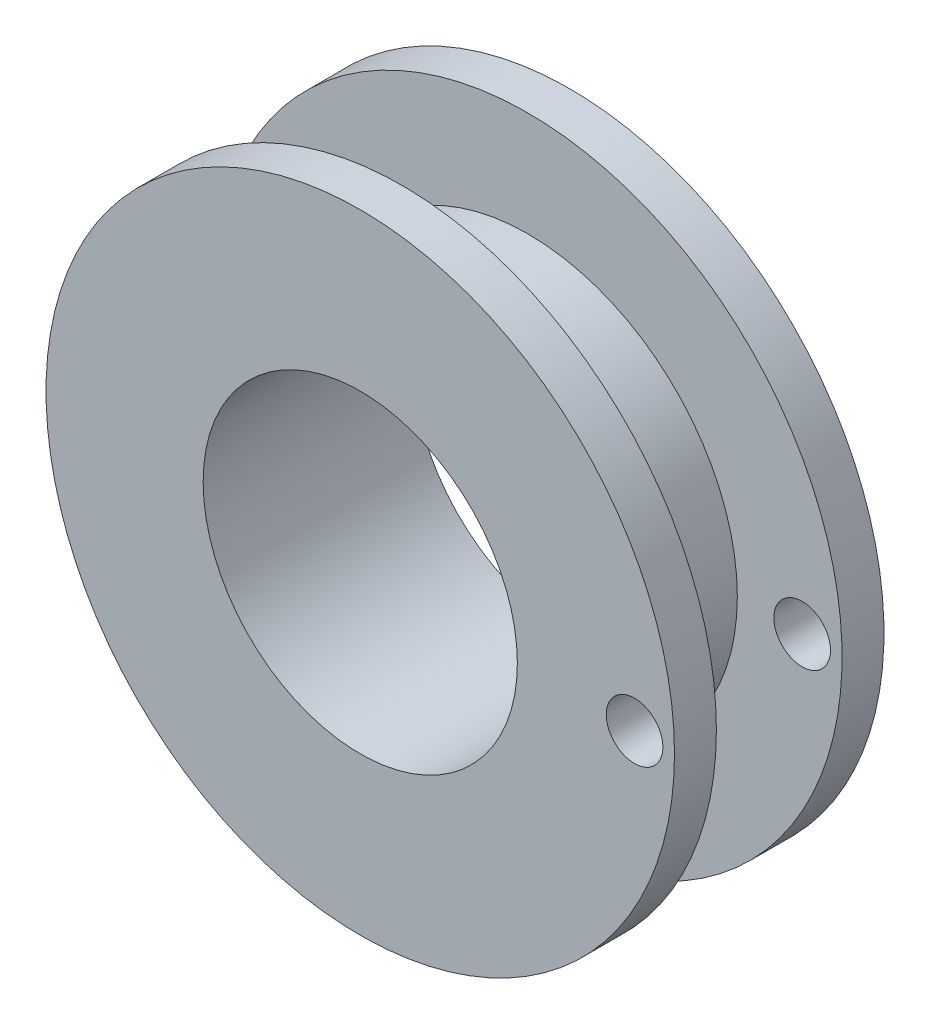
ISO-10303-21;
HEADER;
FILE_DESCRIPTION(('STEP AP214'),'2;1');
FILE_NAME('part.step','',(''),(''),'','','');
FILE_SCHEMA(('AUTOMOTIVE_DESIGN { 1 0 10303 214 1 1 1 1 }'));
ENDSEC;
DATA;
#1=APPLICATION_CONTEXT('core data for automotive mechanical design processes');
#2=APPLICATION_PROTOCOL_DEFINITION('international standard','automotive_design',2000,#1);
#3=PRODUCT_CONTEXT('',#1,'mechanical');
#4=PRODUCT('Part','Part','',(#3));
#5=PRODUCT_RELATED_PRODUCT_CATEGORY('part','',(#4));
#6=PRODUCT_DEFINITION_FORMATION('','',#4);
#7=PRODUCT_DEFINITION_CONTEXT('part definition',#1,'design');
#8=PRODUCT_DEFINITION('design','',#6,#7);
#9=PRODUCT_DEFINITION_SHAPE('','',#8);
#10=(LENGTH_UNIT() NAMED_UNIT(*) SI_UNIT(.MILLI.,.METRE.));
#11=(NAMED_UNIT(*) PLANE_ANGLE_UNIT() SI_UNIT($,.RADIAN.));
#12=(NAMED_UNIT(*) SI_UNIT($,.STERADIAN.) SOLID_ANGLE_UNIT());
#13=UNCERTAINTY_MEASURE_WITH_UNIT(LENGTH_MEASURE(1.E-05),#10,'distance_accuracy_value','');
#14=(GEOMETRIC_REPRESENTATION_CONTEXT(3) GLOBAL_UNCERTAINTY_ASSIGNED_CONTEXT((#13)) GLOBAL_UNIT_ASSIGNED_CONTEXT((#10,
#11,#12)) REPRESENTATION_CONTEXT('',''));
#15=CARTESIAN_POINT('',(0.,0.,0.));
#16=DIRECTION('',(0.,0.,1.));
#17=DIRECTION('',(1.,0.,0.));
#18=AXIS2_PLACEMENT_3D('',#15,#16,#17);
#19=CARTESIAN_POINT('',(0.,0.,6.));
#20=DIRECTION('',(0.,0.,-1.));
#21=DIRECTION('',(-1.,0.,0.));
#22=AXIS2_PLACEMENT_3D('',#19,#20,#21);
#23=CYLINDRICAL_SURFACE('',#22,10.);
#24=CARTESIAN_POINT('',(0.,0.,6.));
#25=DIRECTION('',(0.,0.,1.));
#26=DIRECTION('',(1.,0.,0.));
#27=AXIS2_PLACEMENT_3D('',#24,#25,#26);
#28=CIRCLE('',#27,10.);
#29=CARTESIAN_POINT('',(10.,0.,6.));
#30=VERTEX_POINT('',#29);
#31=EDGE_CURVE('E10',#30,#30,#28,.T.);
#32=ORIENTED_EDGE('',*,*,#31,.F.);
#33=EDGE_LOOP('',(#32));
#34=FACE_BOUND('',#33,.T.);
#35=CARTESIAN_POINT('',(0.,0.,0.));
#36=DIRECTION('',(0.,0.,1.));
#37=DIRECTION('',(1.,0.,0.));
#38=AXIS2_PLACEMENT_3D('',#35,#36,#37);
#39=CIRCLE('',#38,10.);
#40=CARTESIAN_POINT('',(10.,0.,0.));
#41=VERTEX_POINT('',#40);
#42=EDGE_CURVE('E49',#41,#41,#39,.T.);
#43=ORIENTED_EDGE('',*,*,#42,.T.);
#44=EDGE_LOOP('',(#43));
#45=FACE_BOUND('',#44,.T.);
#46=ADVANCED_FACE('F41',(#34,#45),#23,.T.);
#47=CARTESIAN_POINT('',(0.,0.,-2.));
#48=DIRECTION('',(0.,0.,1.));
#49=DIRECTION('',(1.,0.,0.));
#50=AXIS2_PLACEMENT_3D('',#47,#48,#49);
#51=CYLINDRICAL_SURFACE('',#50,15.);
#52=CARTESIAN_POINT('',(0.,0.,-2.));
#53=DIRECTION('',(0.,0.,-1.));
#54=DIRECTION('',(-1.,0.,0.));
#55=AXIS2_PLACEMENT_3D('',#52,#53,#54);
#56=CIRCLE('',#55,15.);
#57=CARTESIAN_POINT('',(-15.,0.,-2.));
#58=VERTEX_POINT('',#57);
#59=EDGE_CURVE('E55',#58,#58,#56,.T.);
#60=ORIENTED_EDGE('',*,*,#59,.F.);
#61=EDGE_LOOP('',(#60));
#62=FACE_BOUND('',#61,.T.);
#63=CARTESIAN_POINT('',(0.,0.,0.));
#64=DIRECTION('',(0.,0.,-1.));
#65=DIRECTION('',(-1.,0.,0.));
#66=AXIS2_PLACEMENT_3D('',#63,#64,#65);
#67=CIRCLE('',#66,15.);
#68=CARTESIAN_POINT('',(-15.,0.,0.));
#69=VERTEX_POINT('',#68);
#70=EDGE_CURVE('E57',#69,#69,#67,.T.);
#71=ORIENTED_EDGE('',*,*,#70,.T.);
#72=EDGE_LOOP('',(#71));
#73=FACE_BOUND('',#72,.T.);
#74=ADVANCED_FACE('F113',(#62,#73),#51,.T.);
#75=CARTESIAN_POINT('',(0.,0.,-2.));
#76=DIRECTION('',(0.,0.,-1.));
#77=DIRECTION('',(-1.,0.,0.));
#78=AXIS2_PLACEMENT_3D('',#75,#76,#77);
#79=PLANE('',#78);
#80=CARTESIAN_POINT('',(13.0946261625598,0.,-2.));
#81=DIRECTION('',(0.,0.,1.));
#82=DIRECTION('',(1.,0.,0.));
#83=AXIS2_PLACEMENT_3D('',#80,#81,#82);
#84=CIRCLE('',#83,1.35178605192168);
#85=CARTESIAN_POINT('',(14.4464122144815,0.,-2.));
#86=VERTEX_POINT('',#85);
#87=EDGE_CURVE('E88',#86,#86,#84,.T.);
#88=ORIENTED_EDGE('',*,*,#87,.T.);
#89=EDGE_LOOP('',(#88));
#90=FACE_BOUND('',#89,.T.);
#91=CARTESIAN_POINT('',(0.,0.,-2.));
#92=DIRECTION('',(0.,0.,1.));
#93=DIRECTION('',(1.,0.,0.));
#94=AXIS2_PLACEMENT_3D('',#91,#92,#93);
#95=CIRCLE('',#94,7.5);
#96=CARTESIAN_POINT('',(7.5,0.,-2.));
#97=VERTEX_POINT('',#96);
#98=EDGE_CURVE('E69',#97,#97,#95,.T.);
#99=ORIENTED_EDGE('',*,*,#98,.T.);
#100=EDGE_LOOP('',(#99));
#101=FACE_BOUND('',#100,.T.);
#102=ORIENTED_EDGE('',*,*,#59,.T.);
#103=EDGE_LOOP('',(#102));
#104=FACE_BOUND('',#103,.T.);
#105=ADVANCED_FACE('F118',(#90,#101,#104),#79,.T.);
#106=CARTESIAN_POINT('',(0.,0.,0.));
#107=DIRECTION('',(0.,0.,-1.));
#108=DIRECTION('',(-1.,0.,0.));
#109=AXIS2_PLACEMENT_3D('',#106,#107,#108);
#110=PLANE('',#109);
#111=CARTESIAN_POINT('',(13.0946261625598,0.,0.));
#112=DIRECTION('',(0.,0.,-1.));
#113=DIRECTION('',(-1.,0.,0.));
#114=AXIS2_PLACEMENT_3D('',#111,#112,#113);
#115=CIRCLE('',#114,1.35178605192168);
#116=CARTESIAN_POINT('',(11.7428401106381,0.,0.));
#117=VERTEX_POINT('',#116);
#118=EDGE_CURVE('E77',#117,#117,#115,.T.);
#119=ORIENTED_EDGE('',*,*,#118,.T.);
#120=EDGE_LOOP('',(#119));
#121=FACE_BOUND('',#120,.T.);
#122=ORIENTED_EDGE('',*,*,#42,.F.);
#123=EDGE_LOOP('',(#122));
#124=FACE_BOUND('',#123,.T.);
#125=ORIENTED_EDGE('',*,*,#70,.F.);
#126=EDGE_LOOP('',(#125));
#127=FACE_BOUND('',#126,.T.);
#128=ADVANCED_FACE('F123',(#121,#124,#127),#110,.F.);
#129=CARTESIAN_POINT('',(0.,0.,8.));
#130=DIRECTION('',(0.,0.,-1.));
#131=DIRECTION('',(-1.,0.,0.));
#132=AXIS2_PLACEMENT_3D('',#129,#130,#131);
#133=CYLINDRICAL_SURFACE('',#132,15.);
#134=CARTESIAN_POINT('',(0.,0.,8.));
#135=DIRECTION('',(0.,0.,1.));
#136=DIRECTION('',(1.,0.,0.));
#137=AXIS2_PLACEMENT_3D('',#134,#135,#136);
#138=CIRCLE('',#137,15.);
#139=CARTESIAN_POINT('',(15.,0.,8.));
#140=VERTEX_POINT('',#139);
#141=EDGE_CURVE('E61',#140,#140,#138,.T.);
#142=ORIENTED_EDGE('',*,*,#141,.F.);
#143=EDGE_LOOP('',(#142));
#144=FACE_BOUND('',#143,.T.);
#145=CARTESIAN_POINT('',(0.,0.,6.));
#146=DIRECTION('',(0.,0.,1.));
#147=DIRECTION('',(1.,0.,0.));
#148=AXIS2_PLACEMENT_3D('',#145,#146,#147);
#149=CIRCLE('',#148,15.);
#150=CARTESIAN_POINT('',(15.,0.,6.));
#151=VERTEX_POINT('',#150);
#152=EDGE_CURVE('E65',#151,#151,#149,.T.);
#153=ORIENTED_EDGE('',*,*,#152,.T.);
#154=EDGE_LOOP('',(#153));
#155=FACE_BOUND('',#154,.T.);
#156=ADVANCED_FACE('F126',(#144,#155),#133,.T.);
#157=CARTESIAN_POINT('',(0.,0.,8.));
#158=DIRECTION('',(0.,0.,1.));
#159=DIRECTION('',(1.,0.,0.));
#160=AXIS2_PLACEMENT_3D('',#157,#158,#159);
#161=PLANE('',#160);
#162=CARTESIAN_POINT('',(13.0946261625598,0.,8.));
#163=DIRECTION('',(0.,0.,1.));
#164=DIRECTION('',(1.,0.,0.));
#165=AXIS2_PLACEMENT_3D('',#162,#163,#164);
#166=CIRCLE('',#165,1.35178605192168);
#167=CARTESIAN_POINT('',(14.4464122144815,0.,8.));
#168=VERTEX_POINT('',#167);
#169=EDGE_CURVE('E84',#168,#168,#166,.T.);
#170=ORIENTED_EDGE('',*,*,#169,.F.);
#171=EDGE_LOOP('',(#170));
#172=FACE_BOUND('',#171,.T.);
#173=CARTESIAN_POINT('',(0.,0.,8.));
#174=DIRECTION('',(0.,0.,1.));
#175=DIRECTION('',(1.,0.,0.));
#176=AXIS2_PLACEMENT_3D('',#173,#174,#175);
#177=CIRCLE('',#176,7.5);
#178=CARTESIAN_POINT('',(7.5,0.,8.));
#179=VERTEX_POINT('',#178);
#180=EDGE_CURVE('E73',#179,#179,#177,.T.);
#181=ORIENTED_EDGE('',*,*,#180,.F.);
#182=EDGE_LOOP('',(#181));
#183=FACE_BOUND('',#182,.T.);
#184=ORIENTED_EDGE('',*,*,#141,.T.);
#185=EDGE_LOOP('',(#184));
#186=FACE_BOUND('',#185,.T.);
#187=ADVANCED_FACE('F135',(#172,#183,#186),#161,.T.);
#188=CARTESIAN_POINT('',(0.,0.,6.));
#189=DIRECTION('',(0.,0.,1.));
#190=DIRECTION('',(1.,0.,0.));
#191=AXIS2_PLACEMENT_3D('',#188,#189,#190);
#192=PLANE('',#191);
#193=CARTESIAN_POINT('',(13.0946261625598,0.,6.));
#194=DIRECTION('',(0.,0.,1.));
#195=DIRECTION('',(1.,0.,0.));
#196=AXIS2_PLACEMENT_3D('',#193,#194,#195);
#197=CIRCLE('',#196,1.35178605192168);
#198=CARTESIAN_POINT('',(14.4464122144815,0.,6.));
#199=VERTEX_POINT('',#198);
#200=EDGE_CURVE('E44',#199,#199,#197,.T.);
#201=ORIENTED_EDGE('',*,*,#200,.T.);
#202=EDGE_LOOP('',(#201));
#203=FACE_BOUND('',#202,.T.);
#204=ORIENTED_EDGE('',*,*,#31,.T.);
#205=EDGE_LOOP('',(#204));
#206=FACE_BOUND('',#205,.T.);
#207=ORIENTED_EDGE('',*,*,#152,.F.);
#208=EDGE_LOOP('',(#207));
#209=FACE_BOUND('',#208,.T.);
#210=ADVANCED_FACE('F97',(#203,#206,#209),#192,.F.);
#211=CARTESIAN_POINT('',(0.,0.,-2.));
#212=DIRECTION('',(0.,0.,1.));
#213=DIRECTION('',(1.,0.,0.));
#214=AXIS2_PLACEMENT_3D('',#211,#212,#213);
#215=CYLINDRICAL_SURFACE('',#214,7.5);
#216=ORIENTED_EDGE('',*,*,#98,.F.);
#217=EDGE_LOOP('',(#216));
#218=FACE_BOUND('',#217,.T.);
#219=ORIENTED_EDGE('',*,*,#180,.T.);
#220=EDGE_LOOP('',(#219));
#221=FACE_BOUND('',#220,.T.);
#222=ADVANCED_FACE('F102',(#218,#221),#215,.F.);
#223=CARTESIAN_POINT('',(13.0946261625598,0.,-2.));
#224=DIRECTION('',(0.,0.,1.));
#225=DIRECTION('',(1.,0.,0.));
#226=AXIS2_PLACEMENT_3D('',#223,#224,#225);
#227=CYLINDRICAL_SURFACE('',#226,1.35178605192168);
#228=ORIENTED_EDGE('',*,*,#169,.T.);
#229=EDGE_LOOP('',(#228));
#230=FACE_BOUND('',#229,.T.);
#231=ORIENTED_EDGE('',*,*,#200,.F.);
#232=EDGE_LOOP('',(#231));
#233=FACE_BOUND('',#232,.T.);
#234=ADVANCED_FACE('F99',(#230,#233),#227,.F.);
#235=ORIENTED_EDGE('',*,*,#87,.F.);
#236=EDGE_LOOP('',(#235));
#237=FACE_BOUND('',#236,.T.);
#238=ORIENTED_EDGE('',*,*,#118,.F.);
#239=EDGE_LOOP('',(#238));
#240=FACE_BOUND('',#239,.T.);
#241=ADVANCED_FACE('F101',(#237,#240),#227,.F.);
#242=CLOSED_SHELL('',(#46,#74,#105,#128,#156,#187,#210,#222,#234,#241));
#243=MANIFOLD_SOLID_BREP('B2',#242);
#244=ADVANCED_BREP_SHAPE_REPRESENTATION('',(#18,#243),#14);
#245=SHAPE_DEFINITION_REPRESENTATION(#9,#244);
ENDSEC;
END-ISO-10303-21;
